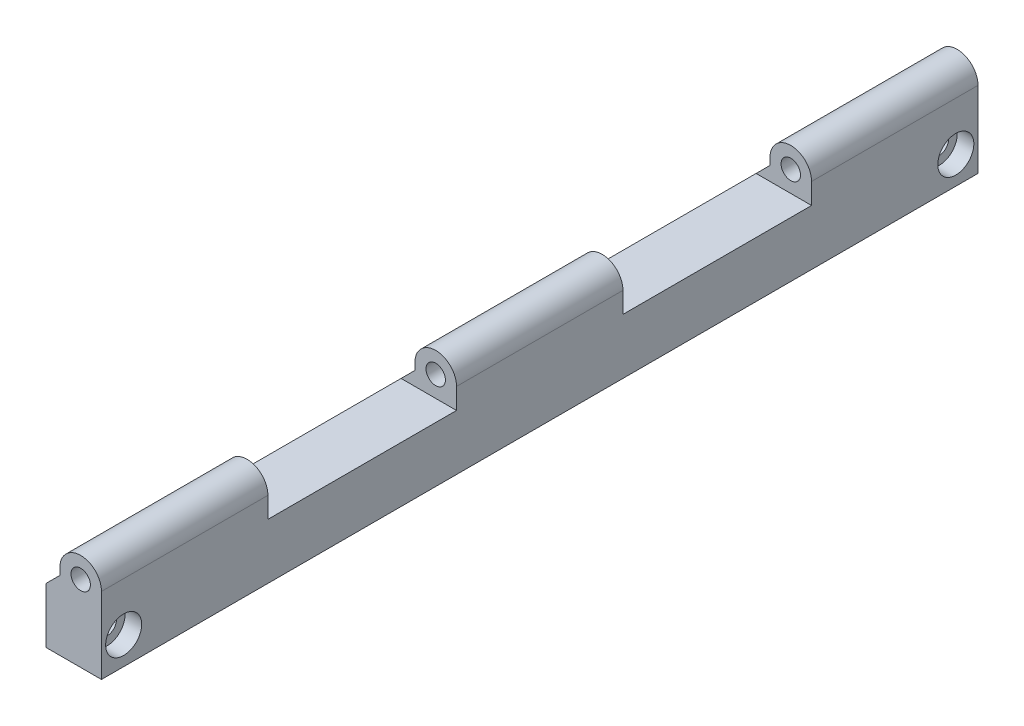
ISO-10303-21;
HEADER;
FILE_DESCRIPTION(('STEP AP214'),'2;1');
FILE_NAME('part.step','',(''),(''),'','','');
FILE_SCHEMA(('AUTOMOTIVE_DESIGN { 1 0 10303 214 1 1 1 1 }'));
ENDSEC;
DATA;
#1=APPLICATION_CONTEXT('core data for automotive mechanical design processes');
#2=APPLICATION_PROTOCOL_DEFINITION('international standard','automotive_design',2000,#1);
#3=PRODUCT_CONTEXT('',#1,'mechanical');
#4=PRODUCT('Part','Part','',(#3));
#5=PRODUCT_RELATED_PRODUCT_CATEGORY('part','',(#4));
#6=PRODUCT_DEFINITION_FORMATION('','',#4);
#7=PRODUCT_DEFINITION_CONTEXT('part definition',#1,'design');
#8=PRODUCT_DEFINITION('design','',#6,#7);
#9=PRODUCT_DEFINITION_SHAPE('','',#8);
#10=(LENGTH_UNIT() NAMED_UNIT(*) SI_UNIT(.MILLI.,.METRE.));
#11=(NAMED_UNIT(*) PLANE_ANGLE_UNIT() SI_UNIT($,.RADIAN.));
#12=(NAMED_UNIT(*) SI_UNIT($,.STERADIAN.) SOLID_ANGLE_UNIT());
#13=UNCERTAINTY_MEASURE_WITH_UNIT(LENGTH_MEASURE(1.E-05),#10,'distance_accuracy_value','');
#14=(GEOMETRIC_REPRESENTATION_CONTEXT(3) GLOBAL_UNCERTAINTY_ASSIGNED_CONTEXT((#13)) GLOBAL_UNIT_ASSIGNED_CONTEXT((#10,
#11,#12)) REPRESENTATION_CONTEXT('',''));
#15=CARTESIAN_POINT('',(0.,0.,0.));
#16=DIRECTION('',(0.,0.,1.));
#17=DIRECTION('',(1.,0.,0.));
#18=AXIS2_PLACEMENT_3D('',#15,#16,#17);
#19=CARTESIAN_POINT('',(-5.,5.,79.));
#20=DIRECTION('',(0.,-1.,0.));
#21=DIRECTION('',(0.,0.,-1.));
#22=AXIS2_PLACEMENT_3D('',#19,#20,#21);
#23=PLANE('',#22);
#24=DIRECTION('',(0.,0.,-1.));
#25=VECTOR('',#24,1.);
#26=CARTESIAN_POINT('',(-5.,5.,79.));
#27=LINE('',#26,#25);
#28=CARTESIAN_POINT('',(-5.,5.,-15.));
#29=VERTEX_POINT('',#28);
#30=CARTESIAN_POINT('',(-5.,5.,-49.));
#31=VERTEX_POINT('',#30);
#32=EDGE_CURVE('E309',#29,#31,#27,.T.);
#33=ORIENTED_EDGE('',*,*,#32,.F.);
#34=DIRECTION('',(1.,0.,0.));
#35=VECTOR('',#34,1.);
#36=CARTESIAN_POINT('',(0.,5.,-15.));
#37=LINE('',#36,#35);
#38=CARTESIAN_POINT('',(5.,5.,-15.));
#39=VERTEX_POINT('',#38);
#40=EDGE_CURVE('E190',#29,#39,#37,.T.);
#41=ORIENTED_EDGE('',*,*,#40,.T.);
#42=DIRECTION('',(0.,0.,-1.));
#43=VECTOR('',#42,1.);
#44=CARTESIAN_POINT('',(5.,5.,79.));
#45=LINE('',#44,#43);
#46=CARTESIAN_POINT('',(5.,5.,-49.));
#47=VERTEX_POINT('',#46);
#48=EDGE_CURVE('E271',#39,#47,#45,.T.);
#49=ORIENTED_EDGE('',*,*,#48,.T.);
#50=DIRECTION('',(1.,0.,0.));
#51=VECTOR('',#50,1.);
#52=CARTESIAN_POINT('',(0.,5.,-49.));
#53=LINE('',#52,#51);
#54=EDGE_CURVE('E224',#31,#47,#53,.T.);
#55=ORIENTED_EDGE('',*,*,#54,.F.);
#56=EDGE_LOOP('',(#33,#41,#49,#55));
#57=FACE_BOUND('',#56,.T.);
#58=ADVANCED_FACE('F34',(#57),#23,.F.);
#59=CARTESIAN_POINT('',(-5.,5.,49.));
#60=VERTEX_POINT('',#59);
#61=CARTESIAN_POINT('',(-5.,5.,15.));
#62=VERTEX_POINT('',#61);
#63=EDGE_CURVE('E272',#60,#62,#27,.T.);
#64=ORIENTED_EDGE('',*,*,#63,.F.);
#65=DIRECTION('',(1.,0.,0.));
#66=VECTOR('',#65,1.);
#67=CARTESIAN_POINT('',(0.,5.,49.));
#68=LINE('',#67,#66);
#69=CARTESIAN_POINT('',(5.,5.,49.));
#70=VERTEX_POINT('',#69);
#71=EDGE_CURVE('E178',#60,#70,#68,.T.);
#72=ORIENTED_EDGE('',*,*,#71,.T.);
#73=CARTESIAN_POINT('',(5.,5.,15.));
#74=VERTEX_POINT('',#73);
#75=EDGE_CURVE('E273',#70,#74,#45,.T.);
#76=ORIENTED_EDGE('',*,*,#75,.T.);
#77=DIRECTION('',(1.,0.,0.));
#78=VECTOR('',#77,1.);
#79=CARTESIAN_POINT('',(0.,5.,15.));
#80=LINE('',#79,#78);
#81=EDGE_CURVE('E192',#62,#74,#80,.T.);
#82=ORIENTED_EDGE('',*,*,#81,.F.);
#83=EDGE_LOOP('',(#64,#72,#76,#82));
#84=FACE_BOUND('',#83,.T.);
#85=ADVANCED_FACE('F346',(#84),#23,.F.);
#86=CARTESIAN_POINT('',(5.,5.,79.));
#87=DIRECTION('',(-1.,0.,0.));
#88=DIRECTION('',(0.,-1.,0.));
#89=AXIS2_PLACEMENT_3D('',#86,#87,#88);
#90=PLANE('',#89);
#91=CARTESIAN_POINT('',(5.,0.,75.));
#92=DIRECTION('',(1.,0.,0.));
#93=DIRECTION('',(0.,0.,-1.));
#94=AXIS2_PLACEMENT_3D('',#91,#92,#93);
#95=CIRCLE('',#94,3.25);
#96=CARTESIAN_POINT('',(5.,0.,71.75));
#97=VERTEX_POINT('',#96);
#98=EDGE_CURVE('E363',#97,#97,#95,.T.);
#99=ORIENTED_EDGE('',*,*,#98,.F.);
#100=EDGE_LOOP('',(#99));
#101=FACE_BOUND('',#100,.T.);
#102=CARTESIAN_POINT('',(5.,0.,-75.));
#103=DIRECTION('',(1.,0.,0.));
#104=DIRECTION('',(0.,0.,-1.));
#105=AXIS2_PLACEMENT_3D('',#102,#103,#104);
#106=CIRCLE('',#105,3.25);
#107=CARTESIAN_POINT('',(5.,0.,-78.25));
#108=VERTEX_POINT('',#107);
#109=EDGE_CURVE('E366',#108,#108,#106,.T.);
#110=ORIENTED_EDGE('',*,*,#109,.F.);
#111=EDGE_LOOP('',(#110));
#112=FACE_BOUND('',#111,.T.);
#113=DIRECTION('',(0.,1.,0.));
#114=VECTOR('',#113,1.);
#115=CARTESIAN_POINT('',(5.,5.,-79.));
#116=LINE('',#115,#114);
#117=CARTESIAN_POINT('',(5.,-5.,-79.));
#118=VERTEX_POINT('',#117);
#119=CARTESIAN_POINT('',(5.,8.75,-79.));
#120=VERTEX_POINT('',#119);
#121=EDGE_CURVE('E248',#118,#120,#116,.T.);
#122=ORIENTED_EDGE('',*,*,#121,.T.);
#123=DIRECTION('',(0.,0.,-1.));
#124=VECTOR('',#123,1.);
#125=CARTESIAN_POINT('',(5.,8.75,-49.));
#126=LINE('',#125,#124);
#127=CARTESIAN_POINT('',(5.,8.75,-49.));
#128=VERTEX_POINT('',#127);
#129=EDGE_CURVE('E245',#128,#120,#126,.T.);
#130=ORIENTED_EDGE('',*,*,#129,.F.);
#131=DIRECTION('',(0.,1.,0.));
#132=VECTOR('',#131,1.);
#133=CARTESIAN_POINT('',(5.,0.,-49.));
#134=LINE('',#133,#132);
#135=EDGE_CURVE('E233',#47,#128,#134,.T.);
#136=ORIENTED_EDGE('',*,*,#135,.F.);
#137=ORIENTED_EDGE('',*,*,#48,.F.);
#138=DIRECTION('',(0.,1.,0.));
#139=VECTOR('',#138,1.);
#140=CARTESIAN_POINT('',(5.,0.,-15.));
#141=LINE('',#140,#139);
#142=CARTESIAN_POINT('',(5.,8.75,-15.));
#143=VERTEX_POINT('',#142);
#144=EDGE_CURVE('E214',#39,#143,#141,.T.);
#145=ORIENTED_EDGE('',*,*,#144,.T.);
#146=DIRECTION('',(0.,0.,-1.));
#147=VECTOR('',#146,1.);
#148=CARTESIAN_POINT('',(5.,8.75,15.));
#149=LINE('',#148,#147);
#150=CARTESIAN_POINT('',(5.,8.75,15.));
#151=VERTEX_POINT('',#150);
#152=EDGE_CURVE('E219',#151,#143,#149,.T.);
#153=ORIENTED_EDGE('',*,*,#152,.F.);
#154=DIRECTION('',(0.,1.,0.));
#155=VECTOR('',#154,1.);
#156=CARTESIAN_POINT('',(5.,0.,15.));
#157=LINE('',#156,#155);
#158=EDGE_CURVE('E201',#74,#151,#157,.T.);
#159=ORIENTED_EDGE('',*,*,#158,.F.);
#160=ORIENTED_EDGE('',*,*,#75,.F.);
#161=DIRECTION('',(0.,1.,0.));
#162=VECTOR('',#161,1.);
#163=CARTESIAN_POINT('',(5.,0.,49.));
#164=LINE('',#163,#162);
#165=CARTESIAN_POINT('',(5.,8.75,49.));
#166=VERTEX_POINT('',#165);
#167=EDGE_CURVE('E185',#70,#166,#164,.T.);
#168=ORIENTED_EDGE('',*,*,#167,.T.);
#169=DIRECTION('',(0.,0.,-1.));
#170=VECTOR('',#169,1.);
#171=CARTESIAN_POINT('',(5.,8.75,79.));
#172=LINE('',#171,#170);
#173=CARTESIAN_POINT('',(5.,8.75,79.));
#174=VERTEX_POINT('',#173);
#175=EDGE_CURVE('E165',#174,#166,#172,.T.);
#176=ORIENTED_EDGE('',*,*,#175,.F.);
#177=DIRECTION('',(0.,1.,0.));
#178=VECTOR('',#177,1.);
#179=CARTESIAN_POINT('',(5.,5.,79.));
#180=LINE('',#179,#178);
#181=CARTESIAN_POINT('',(5.,-5.,79.));
#182=VERTEX_POINT('',#181);
#183=EDGE_CURVE('E171',#182,#174,#180,.T.);
#184=ORIENTED_EDGE('',*,*,#183,.F.);
#185=DIRECTION('',(0.,0.,-1.));
#186=VECTOR('',#185,1.);
#187=CARTESIAN_POINT('',(5.,-5.,79.));
#188=LINE('',#187,#186);
#189=EDGE_CURVE('E257',#182,#118,#188,.T.);
#190=ORIENTED_EDGE('',*,*,#189,.T.);
#191=EDGE_LOOP('',(#122,#130,#136,#137,#145,#153,#159,#160,#168,#176,#184,#190));
#192=FACE_BOUND('',#191,.T.);
#193=ADVANCED_FACE('F324',(#101,#112,#192),#90,.F.);
#194=CARTESIAN_POINT('',(-5.,5.,79.));
#195=DIRECTION('',(1.,0.,0.));
#196=DIRECTION('',(0.,1.,0.));
#197=AXIS2_PLACEMENT_3D('',#194,#195,#196);
#198=PLANE('',#197);
#199=CARTESIAN_POINT('',(-5.,0.,75.));
#200=DIRECTION('',(1.,0.,0.));
#201=DIRECTION('',(0.,0.,-1.));
#202=AXIS2_PLACEMENT_3D('',#199,#200,#201);
#203=CIRCLE('',#202,1.7);
#204=CARTESIAN_POINT('',(-5.,0.,73.3));
#205=VERTEX_POINT('',#204);
#206=EDGE_CURVE('E369',#205,#205,#203,.T.);
#207=ORIENTED_EDGE('',*,*,#206,.T.);
#208=EDGE_LOOP('',(#207));
#209=FACE_BOUND('',#208,.T.);
#210=CARTESIAN_POINT('',(-5.,0.,-75.));
#211=DIRECTION('',(1.,0.,0.));
#212=DIRECTION('',(0.,0.,-1.));
#213=AXIS2_PLACEMENT_3D('',#210,#211,#212);
#214=CIRCLE('',#213,1.7);
#215=CARTESIAN_POINT('',(-5.,0.,-76.7));
#216=VERTEX_POINT('',#215);
#217=EDGE_CURVE('E182',#216,#216,#214,.T.);
#218=ORIENTED_EDGE('',*,*,#217,.T.);
#219=EDGE_LOOP('',(#218));
#220=FACE_BOUND('',#219,.T.);
#221=DIRECTION('',(0.,-1.,0.));
#222=VECTOR('',#221,1.);
#223=CARTESIAN_POINT('',(-5.,5.,-79.));
#224=LINE('',#223,#222);
#225=CARTESIAN_POINT('',(-5.,5.,-79.));
#226=VERTEX_POINT('',#225);
#227=CARTESIAN_POINT('',(-5.,-5.,-79.));
#228=VERTEX_POINT('',#227);
#229=EDGE_CURVE('E259',#226,#228,#224,.T.);
#230=ORIENTED_EDGE('',*,*,#229,.T.);
#231=DIRECTION('',(0.,0.,-1.));
#232=VECTOR('',#231,1.);
#233=CARTESIAN_POINT('',(-5.,-5.,79.));
#234=LINE('',#233,#232);
#235=CARTESIAN_POINT('',(-5.,-5.,79.));
#236=VERTEX_POINT('',#235);
#237=EDGE_CURVE('E264',#236,#228,#234,.T.);
#238=ORIENTED_EDGE('',*,*,#237,.F.);
#239=DIRECTION('',(0.,-1.,0.));
#240=VECTOR('',#239,1.);
#241=CARTESIAN_POINT('',(-5.,5.,79.));
#242=LINE('',#241,#240);
#243=CARTESIAN_POINT('',(-5.,5.,79.));
#244=VERTEX_POINT('',#243);
#245=EDGE_CURVE('E252',#244,#236,#242,.T.);
#246=ORIENTED_EDGE('',*,*,#245,.F.);
#247=EDGE_CURVE('E268',#244,#60,#27,.T.);
#248=ORIENTED_EDGE('',*,*,#247,.T.);
#249=ORIENTED_EDGE('',*,*,#63,.T.);
#250=EDGE_CURVE('E302',#62,#29,#27,.T.);
#251=ORIENTED_EDGE('',*,*,#250,.T.);
#252=ORIENTED_EDGE('',*,*,#32,.T.);
#253=EDGE_CURVE('E267',#31,#226,#27,.T.);
#254=ORIENTED_EDGE('',*,*,#253,.T.);
#255=EDGE_LOOP('',(#230,#238,#246,#248,#249,#251,#252,#254));
#256=FACE_BOUND('',#255,.T.);
#257=ADVANCED_FACE('F300',(#209,#220,#256),#198,.F.);
#258=CARTESIAN_POINT('',(-5.,-5.,79.));
#259=DIRECTION('',(0.,1.,0.));
#260=DIRECTION('',(0.,0.,1.));
#261=AXIS2_PLACEMENT_3D('',#258,#259,#260);
#262=PLANE('',#261);
#263=DIRECTION('',(1.,0.,0.));
#264=VECTOR('',#263,1.);
#265=CARTESIAN_POINT('',(-5.,-5.,-79.));
#266=LINE('',#265,#264);
#267=EDGE_CURVE('E253',#228,#118,#266,.T.);
#268=ORIENTED_EDGE('',*,*,#267,.T.);
#269=ORIENTED_EDGE('',*,*,#189,.F.);
#270=DIRECTION('',(1.,0.,0.));
#271=VECTOR('',#270,1.);
#272=CARTESIAN_POINT('',(-5.,-5.,79.));
#273=LINE('',#272,#271);
#274=EDGE_CURVE('E255',#236,#182,#273,.T.);
#275=ORIENTED_EDGE('',*,*,#274,.F.);
#276=ORIENTED_EDGE('',*,*,#237,.T.);
#277=EDGE_LOOP('',(#268,#269,#275,#276));
#278=FACE_BOUND('',#277,.T.);
#279=ADVANCED_FACE('F321',(#278),#262,.F.);
#280=CARTESIAN_POINT('',(0.,0.,79.));
#281=DIRECTION('',(0.,0.,1.));
#282=DIRECTION('',(1.,0.,0.));
#283=AXIS2_PLACEMENT_3D('',#280,#281,#282);
#284=PLANE('',#283);
#285=ORIENTED_EDGE('',*,*,#183,.T.);
#286=CARTESIAN_POINT('',(1.25,8.75,79.));
#287=DIRECTION('',(0.,0.,-1.));
#288=DIRECTION('',(-1.,0.,0.));
#289=AXIS2_PLACEMENT_3D('',#286,#287,#288);
#290=CIRCLE('',#289,3.75);
#291=CARTESIAN_POINT('',(-2.5,8.75,79.));
#292=VERTEX_POINT('',#291);
#293=EDGE_CURVE('E157',#292,#174,#290,.T.);
#294=ORIENTED_EDGE('',*,*,#293,.F.);
#295=DIRECTION('',(0.,1.,0.));
#296=VECTOR('',#295,1.);
#297=CARTESIAN_POINT('',(-2.5,0.,79.));
#298=LINE('',#297,#296);
#299=CARTESIAN_POINT('',(-2.5,7.49999999999996,79.));
#300=VERTEX_POINT('',#299);
#301=EDGE_CURVE('E146',#300,#292,#298,.T.);
#302=ORIENTED_EDGE('',*,*,#301,.F.);
#303=DIRECTION('',(-0.70710678118655,-0.707106781186546,0.));
#304=VECTOR('',#303,1.);
#305=CARTESIAN_POINT('',(-4.99999999999997,5.,79.));
#306=LINE('',#305,#304);
#307=EDGE_CURVE('E281',#300,#244,#306,.T.);
#308=ORIENTED_EDGE('',*,*,#307,.T.);
#309=ORIENTED_EDGE('',*,*,#245,.T.);
#310=ORIENTED_EDGE('',*,*,#274,.T.);
#311=EDGE_LOOP('',(#285,#294,#302,#308,#309,#310));
#312=FACE_BOUND('',#311,.T.);
#313=CARTESIAN_POINT('',(1.25,8.75,79.));
#314=DIRECTION('',(0.,0.,-1.));
#315=DIRECTION('',(-1.,0.,0.));
#316=AXIS2_PLACEMENT_3D('',#313,#314,#315);
#317=CIRCLE('',#316,1.75);
#318=CARTESIAN_POINT('',(-0.499999999999999,8.75,79.));
#319=VERTEX_POINT('',#318);
#320=EDGE_CURVE('E166',#319,#319,#317,.T.);
#321=ORIENTED_EDGE('',*,*,#320,.T.);
#322=EDGE_LOOP('',(#321));
#323=FACE_BOUND('',#322,.T.);
#324=ADVANCED_FACE('F168',(#312,#323),#284,.T.);
#325=CARTESIAN_POINT('',(0.,0.,-79.));
#326=DIRECTION('',(0.,0.,1.));
#327=DIRECTION('',(1.,0.,0.));
#328=AXIS2_PLACEMENT_3D('',#325,#326,#327);
#329=PLANE('',#328);
#330=ORIENTED_EDGE('',*,*,#121,.F.);
#331=ORIENTED_EDGE('',*,*,#267,.F.);
#332=ORIENTED_EDGE('',*,*,#229,.F.);
#333=DIRECTION('',(0.70710678118655,0.707106781186546,0.));
#334=VECTOR('',#333,1.);
#335=CARTESIAN_POINT('',(-4.99999999999997,5.,-79.));
#336=LINE('',#335,#334);
#337=CARTESIAN_POINT('',(-2.5,7.49999999999996,-79.));
#338=VERTEX_POINT('',#337);
#339=EDGE_CURVE('E42',#226,#338,#336,.T.);
#340=ORIENTED_EDGE('',*,*,#339,.T.);
#341=DIRECTION('',(0.,1.,0.));
#342=VECTOR('',#341,1.);
#343=CARTESIAN_POINT('',(-2.5,0.,-79.));
#344=LINE('',#343,#342);
#345=CARTESIAN_POINT('',(-2.5,8.75,-79.));
#346=VERTEX_POINT('',#345);
#347=EDGE_CURVE('E221',#338,#346,#344,.T.);
#348=ORIENTED_EDGE('',*,*,#347,.T.);
#349=CARTESIAN_POINT('',(1.25,8.75,-79.));
#350=DIRECTION('',(0.,0.,-1.));
#351=DIRECTION('',(-1.,0.,0.));
#352=AXIS2_PLACEMENT_3D('',#349,#350,#351);
#353=CIRCLE('',#352,3.75);
#354=EDGE_CURVE('E240',#346,#120,#353,.T.);
#355=ORIENTED_EDGE('',*,*,#354,.T.);
#356=EDGE_LOOP('',(#330,#331,#332,#340,#348,#355));
#357=FACE_BOUND('',#356,.T.);
#358=CARTESIAN_POINT('',(1.25,8.75,-79.));
#359=DIRECTION('',(0.,0.,-1.));
#360=DIRECTION('',(-1.,0.,0.));
#361=AXIS2_PLACEMENT_3D('',#358,#359,#360);
#362=CIRCLE('',#361,1.75);
#363=CARTESIAN_POINT('',(-0.499999999999999,8.75,-79.));
#364=VERTEX_POINT('',#363);
#365=EDGE_CURVE('E228',#364,#364,#362,.T.);
#366=ORIENTED_EDGE('',*,*,#365,.F.);
#367=EDGE_LOOP('',(#366));
#368=FACE_BOUND('',#367,.T.);
#369=ADVANCED_FACE('F317',(#357,#368),#329,.F.);
#370=CARTESIAN_POINT('',(1.25,8.75,-49.));
#371=DIRECTION('',(0.,0.,-1.));
#372=DIRECTION('',(-1.,0.,0.));
#373=AXIS2_PLACEMENT_3D('',#370,#371,#372);
#374=CYLINDRICAL_SURFACE('',#373,3.75);
#375=ORIENTED_EDGE('',*,*,#354,.F.);
#376=DIRECTION('',(0.,0.,-1.));
#377=VECTOR('',#376,1.);
#378=CARTESIAN_POINT('',(-2.5,8.75,-49.));
#379=LINE('',#378,#377);
#380=CARTESIAN_POINT('',(-2.5,8.75,-49.));
#381=VERTEX_POINT('',#380);
#382=EDGE_CURVE('E238',#381,#346,#379,.T.);
#383=ORIENTED_EDGE('',*,*,#382,.F.);
#384=CARTESIAN_POINT('',(1.25,8.75,-49.));
#385=DIRECTION('',(0.,0.,-1.));
#386=DIRECTION('',(-1.,0.,0.));
#387=AXIS2_PLACEMENT_3D('',#384,#385,#386);
#388=CIRCLE('',#387,3.75);
#389=EDGE_CURVE('E230',#381,#128,#388,.T.);
#390=ORIENTED_EDGE('',*,*,#389,.T.);
#391=ORIENTED_EDGE('',*,*,#129,.T.);
#392=EDGE_LOOP('',(#375,#383,#390,#391));
#393=FACE_BOUND('',#392,.T.);
#394=ADVANCED_FACE('F444',(#393),#374,.T.);
#395=CARTESIAN_POINT('',(-2.5,0.,-49.));
#396=DIRECTION('',(-1.,0.,0.));
#397=DIRECTION('',(0.,0.,1.));
#398=AXIS2_PLACEMENT_3D('',#395,#396,#397);
#399=PLANE('',#398);
#400=ORIENTED_EDGE('',*,*,#347,.F.);
#401=DIRECTION('',(0.,0.,1.));
#402=VECTOR('',#401,1.);
#403=CARTESIAN_POINT('',(-2.5,7.49999999999996,-49.));
#404=LINE('',#403,#402);
#405=CARTESIAN_POINT('',(-2.5,7.49999999999996,-49.));
#406=VERTEX_POINT('',#405);
#407=EDGE_CURVE('E49',#338,#406,#404,.T.);
#408=ORIENTED_EDGE('',*,*,#407,.T.);
#409=DIRECTION('',(0.,1.,0.));
#410=VECTOR('',#409,1.);
#411=CARTESIAN_POINT('',(-2.5,0.,-49.));
#412=LINE('',#411,#410);
#413=EDGE_CURVE('E227',#406,#381,#412,.T.);
#414=ORIENTED_EDGE('',*,*,#413,.T.);
#415=ORIENTED_EDGE('',*,*,#382,.T.);
#416=EDGE_LOOP('',(#400,#408,#414,#415));
#417=FACE_BOUND('',#416,.T.);
#418=ADVANCED_FACE('F442',(#417),#399,.T.);
#419=CARTESIAN_POINT('',(1.25,8.75,-49.));
#420=DIRECTION('',(0.,0.,-1.));
#421=DIRECTION('',(-1.,0.,0.));
#422=AXIS2_PLACEMENT_3D('',#419,#420,#421);
#423=CYLINDRICAL_SURFACE('',#422,1.75);
#424=CARTESIAN_POINT('',(1.25,8.75,-49.));
#425=DIRECTION('',(0.,0.,-1.));
#426=DIRECTION('',(-1.,0.,0.));
#427=AXIS2_PLACEMENT_3D('',#424,#425,#426);
#428=CIRCLE('',#427,1.75);
#429=CARTESIAN_POINT('',(-0.499999999999999,8.75,-49.));
#430=VERTEX_POINT('',#429);
#431=EDGE_CURVE('E235',#430,#430,#428,.T.);
#432=ORIENTED_EDGE('',*,*,#431,.F.);
#433=EDGE_LOOP('',(#432));
#434=FACE_BOUND('',#433,.T.);
#435=ORIENTED_EDGE('',*,*,#365,.T.);
#436=EDGE_LOOP('',(#435));
#437=FACE_BOUND('',#436,.T.);
#438=ADVANCED_FACE('F438',(#434,#437),#423,.F.);
#439=CARTESIAN_POINT('',(0.,0.,-49.));
#440=DIRECTION('',(0.,0.,-1.));
#441=DIRECTION('',(-1.,0.,0.));
#442=AXIS2_PLACEMENT_3D('',#439,#440,#441);
#443=PLANE('',#442);
#444=ORIENTED_EDGE('',*,*,#54,.T.);
#445=ORIENTED_EDGE('',*,*,#135,.T.);
#446=ORIENTED_EDGE('',*,*,#389,.F.);
#447=ORIENTED_EDGE('',*,*,#413,.F.);
#448=DIRECTION('',(-0.70710678118655,-0.707106781186546,0.));
#449=VECTOR('',#448,1.);
#450=CARTESIAN_POINT('',(-4.99999999999997,5.,-49.));
#451=LINE('',#450,#449);
#452=EDGE_CURVE('E11',#406,#31,#451,.T.);
#453=ORIENTED_EDGE('',*,*,#452,.T.);
#454=EDGE_LOOP('',(#444,#445,#446,#447,#453));
#455=FACE_BOUND('',#454,.T.);
#456=ORIENTED_EDGE('',*,*,#431,.T.);
#457=EDGE_LOOP('',(#456));
#458=FACE_BOUND('',#457,.T.);
#459=ADVANCED_FACE('F431',(#455,#458),#443,.F.);
#460=CARTESIAN_POINT('',(1.25,8.75,15.));
#461=DIRECTION('',(0.,0.,-1.));
#462=DIRECTION('',(-1.,0.,0.));
#463=AXIS2_PLACEMENT_3D('',#460,#461,#462);
#464=CYLINDRICAL_SURFACE('',#463,3.75);
#465=CARTESIAN_POINT('',(1.25,8.75,-15.));
#466=DIRECTION('',(0.,0.,-1.));
#467=DIRECTION('',(-1.,0.,0.));
#468=AXIS2_PLACEMENT_3D('',#465,#466,#467);
#469=CIRCLE('',#468,3.75);
#470=CARTESIAN_POINT('',(-2.5,8.75,-15.));
#471=VERTEX_POINT('',#470);
#472=EDGE_CURVE('E211',#471,#143,#469,.T.);
#473=ORIENTED_EDGE('',*,*,#472,.F.);
#474=DIRECTION('',(0.,0.,-1.));
#475=VECTOR('',#474,1.);
#476=CARTESIAN_POINT('',(-2.5,8.75,15.));
#477=LINE('',#476,#475);
#478=CARTESIAN_POINT('',(-2.5,8.75,15.));
#479=VERTEX_POINT('',#478);
#480=EDGE_CURVE('E206',#479,#471,#477,.T.);
#481=ORIENTED_EDGE('',*,*,#480,.F.);
#482=CARTESIAN_POINT('',(1.25,8.75,15.));
#483=DIRECTION('',(0.,0.,-1.));
#484=DIRECTION('',(-1.,0.,0.));
#485=AXIS2_PLACEMENT_3D('',#482,#483,#484);
#486=CIRCLE('',#485,3.75);
#487=EDGE_CURVE('E198',#479,#151,#486,.T.);
#488=ORIENTED_EDGE('',*,*,#487,.T.);
#489=ORIENTED_EDGE('',*,*,#152,.T.);
#490=EDGE_LOOP('',(#473,#481,#488,#489));
#491=FACE_BOUND('',#490,.T.);
#492=ADVANCED_FACE('F428',(#491),#464,.T.);
#493=CARTESIAN_POINT('',(-2.5,0.,15.));
#494=DIRECTION('',(-1.,0.,0.));
#495=DIRECTION('',(0.,0.,1.));
#496=AXIS2_PLACEMENT_3D('',#493,#494,#495);
#497=PLANE('',#496);
#498=DIRECTION('',(0.,1.,0.));
#499=VECTOR('',#498,1.);
#500=CARTESIAN_POINT('',(-2.5,0.,-15.));
#501=LINE('',#500,#499);
#502=CARTESIAN_POINT('',(-2.5,7.49999999999996,-15.));
#503=VERTEX_POINT('',#502);
#504=EDGE_CURVE('E209',#503,#471,#501,.T.);
#505=ORIENTED_EDGE('',*,*,#504,.F.);
#506=DIRECTION('',(0.,0.,1.));
#507=VECTOR('',#506,1.);
#508=CARTESIAN_POINT('',(-2.5,7.49999999999996,15.));
#509=LINE('',#508,#507);
#510=CARTESIAN_POINT('',(-2.5,7.49999999999996,15.));
#511=VERTEX_POINT('',#510);
#512=EDGE_CURVE('E276',#503,#511,#509,.T.);
#513=ORIENTED_EDGE('',*,*,#512,.T.);
#514=DIRECTION('',(0.,1.,0.));
#515=VECTOR('',#514,1.);
#516=CARTESIAN_POINT('',(-2.5,0.,15.));
#517=LINE('',#516,#515);
#518=EDGE_CURVE('E195',#511,#479,#517,.T.);
#519=ORIENTED_EDGE('',*,*,#518,.T.);
#520=ORIENTED_EDGE('',*,*,#480,.T.);
#521=EDGE_LOOP('',(#505,#513,#519,#520));
#522=FACE_BOUND('',#521,.T.);
#523=ADVANCED_FACE('F426',(#522),#497,.T.);
#524=CARTESIAN_POINT('',(1.25,8.75,15.));
#525=DIRECTION('',(0.,0.,-1.));
#526=DIRECTION('',(-1.,0.,0.));
#527=AXIS2_PLACEMENT_3D('',#524,#525,#526);
#528=CYLINDRICAL_SURFACE('',#527,1.75);
#529=CARTESIAN_POINT('',(1.25,8.75,15.));
#530=DIRECTION('',(0.,0.,-1.));
#531=DIRECTION('',(-1.,0.,0.));
#532=AXIS2_PLACEMENT_3D('',#529,#530,#531);
#533=CIRCLE('',#532,1.75);
#534=CARTESIAN_POINT('',(-0.499999999999999,8.75,15.));
#535=VERTEX_POINT('',#534);
#536=EDGE_CURVE('E203',#535,#535,#533,.T.);
#537=ORIENTED_EDGE('',*,*,#536,.F.);
#538=EDGE_LOOP('',(#537));
#539=FACE_BOUND('',#538,.T.);
#540=CARTESIAN_POINT('',(1.25,8.75,-15.));
#541=DIRECTION('',(0.,0.,-1.));
#542=DIRECTION('',(-1.,0.,0.));
#543=AXIS2_PLACEMENT_3D('',#540,#541,#542);
#544=CIRCLE('',#543,1.75);
#545=CARTESIAN_POINT('',(-0.499999999999999,8.75,-15.));
#546=VERTEX_POINT('',#545);
#547=EDGE_CURVE('E196',#546,#546,#544,.T.);
#548=ORIENTED_EDGE('',*,*,#547,.T.);
#549=EDGE_LOOP('',(#548));
#550=FACE_BOUND('',#549,.T.);
#551=ADVANCED_FACE('F420',(#539,#550),#528,.F.);
#552=CARTESIAN_POINT('',(0.,0.,15.));
#553=DIRECTION('',(0.,0.,-1.));
#554=DIRECTION('',(-1.,0.,0.));
#555=AXIS2_PLACEMENT_3D('',#552,#553,#554);
#556=PLANE('',#555);
#557=ORIENTED_EDGE('',*,*,#81,.T.);
#558=ORIENTED_EDGE('',*,*,#158,.T.);
#559=ORIENTED_EDGE('',*,*,#487,.F.);
#560=ORIENTED_EDGE('',*,*,#518,.F.);
#561=DIRECTION('',(-0.70710678118655,-0.707106781186546,0.));
#562=VECTOR('',#561,1.);
#563=CARTESIAN_POINT('',(-4.99999999999997,5.,15.));
#564=LINE('',#563,#562);
#565=EDGE_CURVE('E285',#511,#62,#564,.T.);
#566=ORIENTED_EDGE('',*,*,#565,.T.);
#567=EDGE_LOOP('',(#557,#558,#559,#560,#566));
#568=FACE_BOUND('',#567,.T.);
#569=ORIENTED_EDGE('',*,*,#536,.T.);
#570=EDGE_LOOP('',(#569));
#571=FACE_BOUND('',#570,.T.);
#572=ADVANCED_FACE('F291',(#568,#571),#556,.F.);
#573=CARTESIAN_POINT('',(0.,0.,-15.));
#574=DIRECTION('',(0.,0.,-1.));
#575=DIRECTION('',(-1.,0.,0.));
#576=AXIS2_PLACEMENT_3D('',#573,#574,#575);
#577=PLANE('',#576);
#578=ORIENTED_EDGE('',*,*,#40,.F.);
#579=DIRECTION('',(0.70710678118655,0.707106781186546,0.));
#580=VECTOR('',#579,1.);
#581=CARTESIAN_POINT('',(-4.99999999999997,5.,-15.));
#582=LINE('',#581,#580);
#583=EDGE_CURVE('E283',#29,#503,#582,.T.);
#584=ORIENTED_EDGE('',*,*,#583,.T.);
#585=ORIENTED_EDGE('',*,*,#504,.T.);
#586=ORIENTED_EDGE('',*,*,#472,.T.);
#587=ORIENTED_EDGE('',*,*,#144,.F.);
#588=EDGE_LOOP('',(#578,#584,#585,#586,#587));
#589=FACE_BOUND('',#588,.T.);
#590=ORIENTED_EDGE('',*,*,#547,.F.);
#591=EDGE_LOOP('',(#590));
#592=FACE_BOUND('',#591,.T.);
#593=ADVANCED_FACE('F415',(#589,#592),#577,.T.);
#594=CARTESIAN_POINT('',(1.25,8.75,79.));
#595=DIRECTION('',(0.,0.,-1.));
#596=DIRECTION('',(-1.,0.,0.));
#597=AXIS2_PLACEMENT_3D('',#594,#595,#596);
#598=CYLINDRICAL_SURFACE('',#597,3.75);
#599=CARTESIAN_POINT('',(1.25,8.75,49.));
#600=DIRECTION('',(0.,0.,-1.));
#601=DIRECTION('',(-1.,0.,0.));
#602=AXIS2_PLACEMENT_3D('',#599,#600,#601);
#603=CIRCLE('',#602,3.75);
#604=CARTESIAN_POINT('',(-2.5,8.75,49.));
#605=VERTEX_POINT('',#604);
#606=EDGE_CURVE('E164',#605,#166,#603,.T.);
#607=ORIENTED_EDGE('',*,*,#606,.F.);
#608=DIRECTION('',(0.,0.,-1.));
#609=VECTOR('',#608,1.);
#610=CARTESIAN_POINT('',(-2.5,8.75,79.));
#611=LINE('',#610,#609);
#612=EDGE_CURVE('E150',#292,#605,#611,.T.);
#613=ORIENTED_EDGE('',*,*,#612,.F.);
#614=ORIENTED_EDGE('',*,*,#293,.T.);
#615=ORIENTED_EDGE('',*,*,#175,.T.);
#616=EDGE_LOOP('',(#607,#613,#614,#615));
#617=FACE_BOUND('',#616,.T.);
#618=ADVANCED_FACE('F162',(#617),#598,.T.);
#619=CARTESIAN_POINT('',(-2.5,0.,79.));
#620=DIRECTION('',(-1.,0.,0.));
#621=DIRECTION('',(0.,0.,1.));
#622=AXIS2_PLACEMENT_3D('',#619,#620,#621);
#623=PLANE('',#622);
#624=DIRECTION('',(0.,1.,0.));
#625=VECTOR('',#624,1.);
#626=CARTESIAN_POINT('',(-2.5,0.,49.));
#627=LINE('',#626,#625);
#628=CARTESIAN_POINT('',(-2.5,7.49999999999996,49.));
#629=VERTEX_POINT('',#628);
#630=EDGE_CURVE('E181',#629,#605,#627,.T.);
#631=ORIENTED_EDGE('',*,*,#630,.F.);
#632=DIRECTION('',(0.,0.,1.));
#633=VECTOR('',#632,1.);
#634=CARTESIAN_POINT('',(-2.5,7.49999999999996,79.));
#635=LINE('',#634,#633);
#636=EDGE_CURVE('E153',#629,#300,#635,.T.);
#637=ORIENTED_EDGE('',*,*,#636,.T.);
#638=ORIENTED_EDGE('',*,*,#301,.T.);
#639=ORIENTED_EDGE('',*,*,#612,.T.);
#640=EDGE_LOOP('',(#631,#637,#638,#639));
#641=FACE_BOUND('',#640,.T.);
#642=ADVANCED_FACE('F149',(#641),#623,.T.);
#643=CARTESIAN_POINT('',(1.25,8.75,79.));
#644=DIRECTION('',(0.,0.,-1.));
#645=DIRECTION('',(-1.,0.,0.));
#646=AXIS2_PLACEMENT_3D('',#643,#644,#645);
#647=CYLINDRICAL_SURFACE('',#646,1.75);
#648=ORIENTED_EDGE('',*,*,#320,.F.);
#649=EDGE_LOOP('',(#648));
#650=FACE_BOUND('',#649,.T.);
#651=CARTESIAN_POINT('',(1.25,8.75,49.));
#652=DIRECTION('',(0.,0.,-1.));
#653=DIRECTION('',(-1.,0.,0.));
#654=AXIS2_PLACEMENT_3D('',#651,#652,#653);
#655=CIRCLE('',#654,1.75);
#656=CARTESIAN_POINT('',(-0.499999999999999,8.75,49.));
#657=VERTEX_POINT('',#656);
#658=EDGE_CURVE('E158',#657,#657,#655,.T.);
#659=ORIENTED_EDGE('',*,*,#658,.T.);
#660=EDGE_LOOP('',(#659));
#661=FACE_BOUND('',#660,.T.);
#662=ADVANCED_FACE('F409',(#650,#661),#647,.F.);
#663=CARTESIAN_POINT('',(0.,0.,49.));
#664=DIRECTION('',(0.,0.,-1.));
#665=DIRECTION('',(-1.,0.,0.));
#666=AXIS2_PLACEMENT_3D('',#663,#664,#665);
#667=PLANE('',#666);
#668=ORIENTED_EDGE('',*,*,#71,.F.);
#669=DIRECTION('',(0.70710678118655,0.707106781186546,0.));
#670=VECTOR('',#669,1.);
#671=CARTESIAN_POINT('',(-4.99999999999997,5.,49.));
#672=LINE('',#671,#670);
#673=EDGE_CURVE('E279',#60,#629,#672,.T.);
#674=ORIENTED_EDGE('',*,*,#673,.T.);
#675=ORIENTED_EDGE('',*,*,#630,.T.);
#676=ORIENTED_EDGE('',*,*,#606,.T.);
#677=ORIENTED_EDGE('',*,*,#167,.F.);
#678=EDGE_LOOP('',(#668,#674,#675,#676,#677));
#679=FACE_BOUND('',#678,.T.);
#680=ORIENTED_EDGE('',*,*,#658,.F.);
#681=EDGE_LOOP('',(#680));
#682=FACE_BOUND('',#681,.T.);
#683=ADVANCED_FACE('F329',(#679,#682),#667,.T.);
#684=CARTESIAN_POINT('',(5.,0.,-75.));
#685=DIRECTION('',(1.,0.,0.));
#686=DIRECTION('',(0.,0.,-1.));
#687=AXIS2_PLACEMENT_3D('',#684,#685,#686);
#688=CYLINDRICAL_SURFACE('',#687,1.7);
#689=ORIENTED_EDGE('',*,*,#217,.F.);
#690=EDGE_LOOP('',(#689));
#691=FACE_BOUND('',#690,.T.);
#692=CARTESIAN_POINT('',(2.,0.,-75.));
#693=DIRECTION('',(1.,0.,0.));
#694=DIRECTION('',(0.,0.,-1.));
#695=AXIS2_PLACEMENT_3D('',#692,#693,#694);
#696=CIRCLE('',#695,1.7);
#697=CARTESIAN_POINT('',(2.,0.,-76.7));
#698=VERTEX_POINT('',#697);
#699=EDGE_CURVE('E372',#698,#698,#696,.T.);
#700=ORIENTED_EDGE('',*,*,#699,.T.);
#701=EDGE_LOOP('',(#700));
#702=FACE_BOUND('',#701,.T.);
#703=ADVANCED_FACE('F384',(#691,#702),#688,.F.);
#704=CARTESIAN_POINT('',(2.,1.70000000000003,-75.));
#705=DIRECTION('',(-1.,0.,0.));
#706=DIRECTION('',(0.,0.,1.));
#707=AXIS2_PLACEMENT_3D('',#704,#705,#706);
#708=PLANE('',#707);
#709=ORIENTED_EDGE('',*,*,#699,.F.);
#710=EDGE_LOOP('',(#709));
#711=FACE_BOUND('',#710,.T.);
#712=CARTESIAN_POINT('',(2.,0.,-75.));
#713=DIRECTION('',(1.,0.,0.));
#714=DIRECTION('',(0.,0.,-1.));
#715=AXIS2_PLACEMENT_3D('',#712,#713,#714);
#716=CIRCLE('',#715,3.25);
#717=CARTESIAN_POINT('',(2.,0.,-78.25));
#718=VERTEX_POINT('',#717);
#719=EDGE_CURVE('E368',#718,#718,#716,.T.);
#720=ORIENTED_EDGE('',*,*,#719,.T.);
#721=EDGE_LOOP('',(#720));
#722=FACE_BOUND('',#721,.T.);
#723=ADVANCED_FACE('F387',(#711,#722),#708,.F.);
#724=CARTESIAN_POINT('',(5.,0.,-75.));
#725=DIRECTION('',(1.,0.,0.));
#726=DIRECTION('',(0.,0.,-1.));
#727=AXIS2_PLACEMENT_3D('',#724,#725,#726);
#728=CYLINDRICAL_SURFACE('',#727,3.25);
#729=ORIENTED_EDGE('',*,*,#719,.F.);
#730=EDGE_LOOP('',(#729));
#731=FACE_BOUND('',#730,.T.);
#732=ORIENTED_EDGE('',*,*,#109,.T.);
#733=EDGE_LOOP('',(#732));
#734=FACE_BOUND('',#733,.T.);
#735=ADVANCED_FACE('F393',(#731,#734),#728,.F.);
#736=CARTESIAN_POINT('',(5.,0.,75.));
#737=DIRECTION('',(1.,0.,0.));
#738=DIRECTION('',(0.,0.,-1.));
#739=AXIS2_PLACEMENT_3D('',#736,#737,#738);
#740=CYLINDRICAL_SURFACE('',#739,1.7);
#741=ORIENTED_EDGE('',*,*,#206,.F.);
#742=EDGE_LOOP('',(#741));
#743=FACE_BOUND('',#742,.T.);
#744=CARTESIAN_POINT('',(2.,0.,75.));
#745=DIRECTION('',(1.,0.,0.));
#746=DIRECTION('',(0.,0.,-1.));
#747=AXIS2_PLACEMENT_3D('',#744,#745,#746);
#748=CIRCLE('',#747,1.7);
#749=CARTESIAN_POINT('',(2.,0.,73.3));
#750=VERTEX_POINT('',#749);
#751=EDGE_CURVE('E375',#750,#750,#748,.T.);
#752=ORIENTED_EDGE('',*,*,#751,.T.);
#753=EDGE_LOOP('',(#752));
#754=FACE_BOUND('',#753,.T.);
#755=ADVANCED_FACE('F398',(#743,#754),#740,.F.);
#756=CARTESIAN_POINT('',(2.,1.7,75.));
#757=DIRECTION('',(-1.,0.,0.));
#758=DIRECTION('',(0.,0.,1.));
#759=AXIS2_PLACEMENT_3D('',#756,#757,#758);
#760=PLANE('',#759);
#761=ORIENTED_EDGE('',*,*,#751,.F.);
#762=EDGE_LOOP('',(#761));
#763=FACE_BOUND('',#762,.T.);
#764=CARTESIAN_POINT('',(2.,0.,75.));
#765=DIRECTION('',(1.,0.,0.));
#766=DIRECTION('',(0.,0.,-1.));
#767=AXIS2_PLACEMENT_3D('',#764,#765,#766);
#768=CIRCLE('',#767,3.25);
#769=CARTESIAN_POINT('',(2.,0.,71.75));
#770=VERTEX_POINT('',#769);
#771=EDGE_CURVE('E692',#770,#770,#768,.T.);
#772=ORIENTED_EDGE('',*,*,#771,.T.);
#773=EDGE_LOOP('',(#772));
#774=FACE_BOUND('',#773,.T.);
#775=ADVANCED_FACE('F341',(#763,#774),#760,.F.);
#776=CARTESIAN_POINT('',(5.,0.,75.));
#777=DIRECTION('',(1.,0.,0.));
#778=DIRECTION('',(0.,0.,-1.));
#779=AXIS2_PLACEMENT_3D('',#776,#777,#778);
#780=CYLINDRICAL_SURFACE('',#779,3.25);
#781=ORIENTED_EDGE('',*,*,#771,.F.);
#782=EDGE_LOOP('',(#781));
#783=FACE_BOUND('',#782,.T.);
#784=ORIENTED_EDGE('',*,*,#98,.T.);
#785=EDGE_LOOP('',(#784));
#786=FACE_BOUND('',#785,.T.);
#787=ADVANCED_FACE('F335',(#783,#786),#780,.F.);
#788=CARTESIAN_POINT('',(-4.99999999999997,5.,79.));
#789=DIRECTION('',(0.707106781186545,-0.707106781186549,0.));
#790=DIRECTION('',(0.,0.,-1.));
#791=AXIS2_PLACEMENT_3D('',#788,#789,#790);
#792=PLANE('',#791);
#793=ORIENTED_EDGE('',*,*,#307,.F.);
#794=ORIENTED_EDGE('',*,*,#636,.F.);
#795=ORIENTED_EDGE('',*,*,#673,.F.);
#796=ORIENTED_EDGE('',*,*,#247,.F.);
#797=EDGE_LOOP('',(#793,#794,#795,#796));
#798=FACE_BOUND('',#797,.T.);
#799=ADVANCED_FACE('F333',(#798),#792,.F.);
#800=CARTESIAN_POINT('',(-4.99999999999997,5.,79.));
#801=DIRECTION('',(0.707106781186545,-0.707106781186549,0.));
#802=DIRECTION('',(0.,0.,-1.));
#803=AXIS2_PLACEMENT_3D('',#800,#801,#802);
#804=PLANE('',#803);
#805=ORIENTED_EDGE('',*,*,#565,.F.);
#806=ORIENTED_EDGE('',*,*,#512,.F.);
#807=ORIENTED_EDGE('',*,*,#583,.F.);
#808=ORIENTED_EDGE('',*,*,#250,.F.);
#809=EDGE_LOOP('',(#805,#806,#807,#808));
#810=FACE_BOUND('',#809,.T.);
#811=ADVANCED_FACE('F307',(#810),#804,.F.);
#812=CARTESIAN_POINT('',(-4.99999999999997,5.,79.));
#813=DIRECTION('',(0.707106781186545,-0.707106781186549,0.));
#814=DIRECTION('',(0.,0.,-1.));
#815=AXIS2_PLACEMENT_3D('',#812,#813,#814);
#816=PLANE('',#815);
#817=ORIENTED_EDGE('',*,*,#452,.F.);
#818=ORIENTED_EDGE('',*,*,#407,.F.);
#819=ORIENTED_EDGE('',*,*,#339,.F.);
#820=ORIENTED_EDGE('',*,*,#253,.F.);
#821=EDGE_LOOP('',(#817,#818,#819,#820));
#822=FACE_BOUND('',#821,.T.);
#823=ADVANCED_FACE('F36',(#822),#816,.F.);
#824=CLOSED_SHELL('',(#58,#85,#193,#257,#279,#324,#369,#394,#418,#438,#459,#492,#523,#551,#572,
#593,#618,#642,#662,#683,#703,#723,#735,#755,#775,#787,#799,#811,#823));
#825=MANIFOLD_SOLID_BREP('B2',#824);
#826=ADVANCED_BREP_SHAPE_REPRESENTATION('',(#18,#825),#14);
#827=SHAPE_DEFINITION_REPRESENTATION(#9,#826);
ENDSEC;
END-ISO-10303-21;
